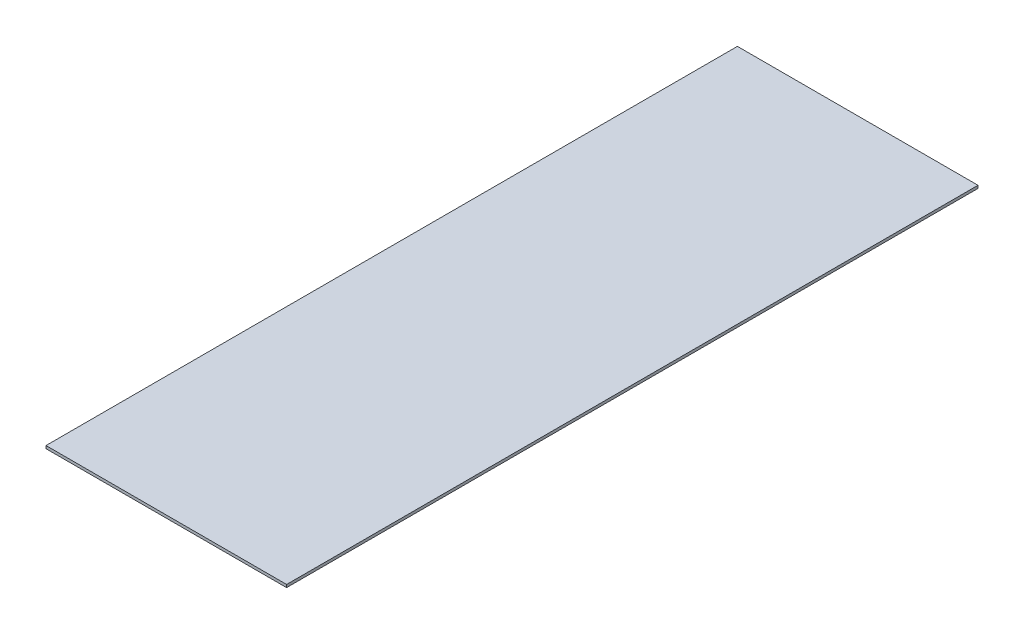
ISO-10303-21;
HEADER;
FILE_DESCRIPTION(('STEP AP214'),'2;1');
FILE_NAME('part.step','',(''),(''),'','','');
FILE_SCHEMA(('AUTOMOTIVE_DESIGN { 1 0 10303 214 1 1 1 1 }'));
ENDSEC;
DATA;
#1=APPLICATION_CONTEXT('core data for automotive mechanical design processes');
#2=APPLICATION_PROTOCOL_DEFINITION('international standard','automotive_design',2000,#1);
#3=PRODUCT_CONTEXT('',#1,'mechanical');
#4=PRODUCT('Part','Part','',(#3));
#5=PRODUCT_RELATED_PRODUCT_CATEGORY('part','',(#4));
#6=PRODUCT_DEFINITION_FORMATION('','',#4);
#7=PRODUCT_DEFINITION_CONTEXT('part definition',#1,'design');
#8=PRODUCT_DEFINITION('design','',#6,#7);
#9=PRODUCT_DEFINITION_SHAPE('','',#8);
#10=(LENGTH_UNIT() NAMED_UNIT(*) SI_UNIT(.MILLI.,.METRE.));
#11=(NAMED_UNIT(*) PLANE_ANGLE_UNIT() SI_UNIT($,.RADIAN.));
#12=(NAMED_UNIT(*) SI_UNIT($,.STERADIAN.) SOLID_ANGLE_UNIT());
#13=UNCERTAINTY_MEASURE_WITH_UNIT(LENGTH_MEASURE(1.E-05),#10,'distance_accuracy_value','');
#14=(GEOMETRIC_REPRESENTATION_CONTEXT(3) GLOBAL_UNCERTAINTY_ASSIGNED_CONTEXT((#13)) GLOBAL_UNIT_ASSIGNED_CONTEXT((#10,
#11,#12)) REPRESENTATION_CONTEXT('',''));
#15=CARTESIAN_POINT('',(0.,0.,0.));
#16=DIRECTION('',(0.,0.,1.));
#17=DIRECTION('',(1.,0.,0.));
#18=AXIS2_PLACEMENT_3D('',#15,#16,#17);
#19=CARTESIAN_POINT('',(0.,2.,0.));
#20=DIRECTION('',(0.,0.,1.));
#21=DIRECTION('',(1.,0.,0.));
#22=AXIS2_PLACEMENT_3D('',#19,#20,#21);
#23=PLANE('',#22);
#24=DIRECTION('',(-1.,0.,0.));
#25=VECTOR('',#24,1.);
#26=CARTESIAN_POINT('',(0.,0.,0.));
#27=LINE('',#26,#25);
#28=CARTESIAN_POINT('',(0.,0.,0.));
#29=VERTEX_POINT('',#28);
#30=CARTESIAN_POINT('',(-174.,0.,0.));
#31=VERTEX_POINT('',#30);
#32=EDGE_CURVE('E103',#29,#31,#27,.T.);
#33=ORIENTED_EDGE('',*,*,#32,.T.);
#34=DIRECTION('',(0.,-1.,0.));
#35=VECTOR('',#34,1.);
#36=CARTESIAN_POINT('',(-174.,2.,0.));
#37=LINE('',#36,#35);
#38=CARTESIAN_POINT('',(-174.,2.,0.));
#39=VERTEX_POINT('',#38);
#40=EDGE_CURVE('E11',#39,#31,#37,.T.);
#41=ORIENTED_EDGE('',*,*,#40,.F.);
#42=DIRECTION('',(-1.,0.,0.));
#43=VECTOR('',#42,1.);
#44=CARTESIAN_POINT('',(0.,2.,0.));
#45=LINE('',#44,#43);
#46=CARTESIAN_POINT('',(0.,2.,0.));
#47=VERTEX_POINT('',#46);
#48=EDGE_CURVE('E91',#47,#39,#45,.T.);
#49=ORIENTED_EDGE('',*,*,#48,.F.);
#50=DIRECTION('',(0.,-1.,0.));
#51=VECTOR('',#50,1.);
#52=CARTESIAN_POINT('',(0.,2.,0.));
#53=LINE('',#52,#51);
#54=EDGE_CURVE('E99',#47,#29,#53,.T.);
#55=ORIENTED_EDGE('',*,*,#54,.T.);
#56=EDGE_LOOP('',(#33,#41,#49,#55));
#57=FACE_BOUND('',#56,.T.);
#58=ADVANCED_FACE('F40',(#57),#23,.F.);
#59=CARTESIAN_POINT('',(-174.,2.,0.));
#60=DIRECTION('',(1.,0.,0.));
#61=DIRECTION('',(0.,0.,-1.));
#62=AXIS2_PLACEMENT_3D('',#59,#60,#61);
#63=PLANE('',#62);
#64=DIRECTION('',(0.,0.,1.));
#65=VECTOR('',#64,1.);
#66=CARTESIAN_POINT('',(-174.,0.,0.));
#67=LINE('',#66,#65);
#68=CARTESIAN_POINT('',(-174.,0.,500.));
#69=VERTEX_POINT('',#68);
#70=EDGE_CURVE('E95',#31,#69,#67,.T.);
#71=ORIENTED_EDGE('',*,*,#70,.T.);
#72=DIRECTION('',(0.,-1.,0.));
#73=VECTOR('',#72,1.);
#74=CARTESIAN_POINT('',(-174.,2.,500.));
#75=LINE('',#74,#73);
#76=CARTESIAN_POINT('',(-174.,2.,500.));
#77=VERTEX_POINT('',#76);
#78=EDGE_CURVE('E48',#77,#69,#75,.T.);
#79=ORIENTED_EDGE('',*,*,#78,.F.);
#80=DIRECTION('',(0.,0.,1.));
#81=VECTOR('',#80,1.);
#82=CARTESIAN_POINT('',(-174.,2.,0.));
#83=LINE('',#82,#81);
#84=EDGE_CURVE('E86',#39,#77,#83,.T.);
#85=ORIENTED_EDGE('',*,*,#84,.F.);
#86=ORIENTED_EDGE('',*,*,#40,.T.);
#87=EDGE_LOOP('',(#71,#79,#85,#86));
#88=FACE_BOUND('',#87,.T.);
#89=ADVANCED_FACE('F94',(#88),#63,.F.);
#90=CARTESIAN_POINT('',(-174.,2.,500.));
#91=DIRECTION('',(0.,0.,-1.));
#92=DIRECTION('',(-1.,0.,0.));
#93=AXIS2_PLACEMENT_3D('',#90,#91,#92);
#94=PLANE('',#93);
#95=DIRECTION('',(1.,0.,0.));
#96=VECTOR('',#95,1.);
#97=CARTESIAN_POINT('',(-174.,0.,500.));
#98=LINE('',#97,#96);
#99=CARTESIAN_POINT('',(0.,0.,500.));
#100=VERTEX_POINT('',#99);
#101=EDGE_CURVE('E73',#69,#100,#98,.T.);
#102=ORIENTED_EDGE('',*,*,#101,.T.);
#103=DIRECTION('',(0.,-1.,0.));
#104=VECTOR('',#103,1.);
#105=CARTESIAN_POINT('',(0.,2.,500.));
#106=LINE('',#105,#104);
#107=CARTESIAN_POINT('',(0.,2.,500.));
#108=VERTEX_POINT('',#107);
#109=EDGE_CURVE('E96',#108,#100,#106,.T.);
#110=ORIENTED_EDGE('',*,*,#109,.F.);
#111=DIRECTION('',(1.,0.,0.));
#112=VECTOR('',#111,1.);
#113=CARTESIAN_POINT('',(-174.,2.,500.));
#114=LINE('',#113,#112);
#115=EDGE_CURVE('E89',#77,#108,#114,.T.);
#116=ORIENTED_EDGE('',*,*,#115,.F.);
#117=ORIENTED_EDGE('',*,*,#78,.T.);
#118=EDGE_LOOP('',(#102,#110,#116,#117));
#119=FACE_BOUND('',#118,.T.);
#120=ADVANCED_FACE('F97',(#119),#94,.F.);
#121=CARTESIAN_POINT('',(0.,2.,500.));
#122=DIRECTION('',(-1.,0.,0.));
#123=DIRECTION('',(0.,0.,1.));
#124=AXIS2_PLACEMENT_3D('',#121,#122,#123);
#125=PLANE('',#124);
#126=DIRECTION('',(0.,0.,-1.));
#127=VECTOR('',#126,1.);
#128=CARTESIAN_POINT('',(0.,0.,500.));
#129=LINE('',#128,#127);
#130=EDGE_CURVE('E79',#100,#29,#129,.T.);
#131=ORIENTED_EDGE('',*,*,#130,.T.);
#132=ORIENTED_EDGE('',*,*,#54,.F.);
#133=DIRECTION('',(0.,0.,-1.));
#134=VECTOR('',#133,1.);
#135=CARTESIAN_POINT('',(0.,2.,500.));
#136=LINE('',#135,#134);
#137=EDGE_CURVE('E56',#108,#47,#136,.T.);
#138=ORIENTED_EDGE('',*,*,#137,.F.);
#139=ORIENTED_EDGE('',*,*,#109,.T.);
#140=EDGE_LOOP('',(#131,#132,#138,#139));
#141=FACE_BOUND('',#140,.T.);
#142=ADVANCED_FACE('F110',(#141),#125,.F.);
#143=CARTESIAN_POINT('',(0.,2.,0.));
#144=DIRECTION('',(0.,1.,0.));
#145=DIRECTION('',(0.,0.,1.));
#146=AXIS2_PLACEMENT_3D('',#143,#144,#145);
#147=PLANE('',#146);
#148=ORIENTED_EDGE('',*,*,#48,.T.);
#149=ORIENTED_EDGE('',*,*,#84,.T.);
#150=ORIENTED_EDGE('',*,*,#115,.T.);
#151=ORIENTED_EDGE('',*,*,#137,.T.);
#152=EDGE_LOOP('',(#148,#149,#150,#151));
#153=FACE_BOUND('',#152,.T.);
#154=ADVANCED_FACE('F87',(#153),#147,.T.);
#155=CARTESIAN_POINT('',(0.,0.,0.));
#156=DIRECTION('',(0.,1.,0.));
#157=DIRECTION('',(0.,0.,1.));
#158=AXIS2_PLACEMENT_3D('',#155,#156,#157);
#159=PLANE('',#158);
#160=ORIENTED_EDGE('',*,*,#32,.F.);
#161=ORIENTED_EDGE('',*,*,#130,.F.);
#162=ORIENTED_EDGE('',*,*,#101,.F.);
#163=ORIENTED_EDGE('',*,*,#70,.F.);
#164=EDGE_LOOP('',(#160,#161,#162,#163));
#165=FACE_BOUND('',#164,.T.);
#166=ADVANCED_FACE('F113',(#165),#159,.F.);
#167=CLOSED_SHELL('',(#58,#89,#120,#142,#154,#166));
#168=MANIFOLD_SOLID_BREP('B2',#167);
#169=ADVANCED_BREP_SHAPE_REPRESENTATION('',(#18,#168),#14);
#170=SHAPE_DEFINITION_REPRESENTATION(#9,#169);
ENDSEC;
END-ISO-10303-21;
